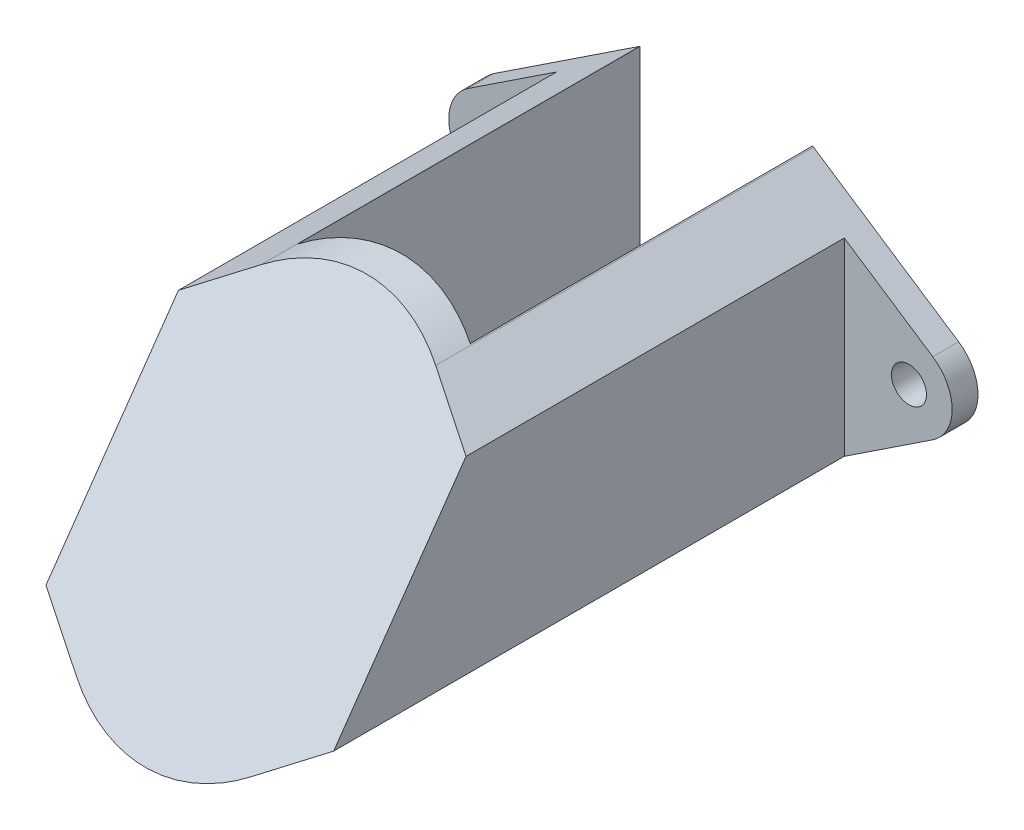
ISO-10303-21;
HEADER;
FILE_DESCRIPTION(('STEP AP214'),'2;1');
FILE_NAME('part.step','',(''),(''),'','','');
FILE_SCHEMA(('AUTOMOTIVE_DESIGN { 1 0 10303 214 1 1 1 1 }'));
ENDSEC;
DATA;
#1=APPLICATION_CONTEXT('core data for automotive mechanical design processes');
#2=APPLICATION_PROTOCOL_DEFINITION('international standard','automotive_design',2000,#1);
#3=PRODUCT_CONTEXT('',#1,'mechanical');
#4=PRODUCT('Part','Part','',(#3));
#5=PRODUCT_RELATED_PRODUCT_CATEGORY('part','',(#4));
#6=PRODUCT_DEFINITION_FORMATION('','',#4);
#7=PRODUCT_DEFINITION_CONTEXT('part definition',#1,'design');
#8=PRODUCT_DEFINITION('design','',#6,#7);
#9=PRODUCT_DEFINITION_SHAPE('','',#8);
#10=(LENGTH_UNIT() NAMED_UNIT(*) SI_UNIT(.MILLI.,.METRE.));
#11=(NAMED_UNIT(*) PLANE_ANGLE_UNIT() SI_UNIT($,.RADIAN.));
#12=(NAMED_UNIT(*) SI_UNIT($,.STERADIAN.) SOLID_ANGLE_UNIT());
#13=UNCERTAINTY_MEASURE_WITH_UNIT(LENGTH_MEASURE(1.E-05),#10,'distance_accuracy_value','');
#14=(GEOMETRIC_REPRESENTATION_CONTEXT(3) GLOBAL_UNCERTAINTY_ASSIGNED_CONTEXT((#13)) GLOBAL_UNIT_ASSIGNED_CONTEXT((#10,
#11,#12)) REPRESENTATION_CONTEXT('',''));
#15=CARTESIAN_POINT('',(0.,0.,0.));
#16=DIRECTION('',(0.,0.,1.));
#17=DIRECTION('',(1.,0.,0.));
#18=AXIS2_PLACEMENT_3D('',#15,#16,#17);
#19=CARTESIAN_POINT('',(-14.5,0.,0.));
#20=DIRECTION('',(0.,0.,1.));
#21=DIRECTION('',(1.,0.,0.));
#22=AXIS2_PLACEMENT_3D('',#19,#20,#21);
#23=PLANE('',#22);
#24=CARTESIAN_POINT('',(-14.5,0.,0.));
#25=DIRECTION('',(0.,0.,1.));
#26=DIRECTION('',(1.,0.,0.));
#27=AXIS2_PLACEMENT_3D('',#24,#25,#26);
#28=CIRCLE('',#27,1.2192);
#29=CARTESIAN_POINT('',(-13.2808,0.,0.));
#30=VERTEX_POINT('',#29);
#31=EDGE_CURVE('E184',#30,#30,#28,.T.);
#32=ORIENTED_EDGE('',*,*,#31,.T.);
#33=EDGE_LOOP('',(#32));
#34=FACE_BOUND('',#33,.T.);
#35=CARTESIAN_POINT('',(0.,0.,0.));
#36=DIRECTION('',(0.,0.,1.));
#37=DIRECTION('',(1.,0.,0.));
#38=AXIS2_PLACEMENT_3D('',#35,#36,#37);
#39=CIRCLE('',#38,11.);
#40=CARTESIAN_POINT('',(-6.00000000000001,9.21954445729288,0.));
#41=VERTEX_POINT('',#40);
#42=CARTESIAN_POINT('',(-6.06896551724138,9.174293299788,0.));
#43=VERTEX_POINT('',#42);
#44=EDGE_CURVE('E244',#41,#43,#39,.T.);
#45=ORIENTED_EDGE('',*,*,#44,.F.);
#46=DIRECTION('',(0.,-1.,0.));
#47=VECTOR('',#46,1.);
#48=CARTESIAN_POINT('',(-6.00000000000001,0.,0.));
#49=LINE('',#48,#47);
#50=CARTESIAN_POINT('',(-6.00000000000001,-9.21954445729288,0.));
#51=VERTEX_POINT('',#50);
#52=EDGE_CURVE('E45',#41,#51,#49,.T.);
#53=ORIENTED_EDGE('',*,*,#52,.T.);
#54=CARTESIAN_POINT('',(0.,0.,0.));
#55=DIRECTION('',(0.,0.,1.));
#56=DIRECTION('',(1.,0.,0.));
#57=AXIS2_PLACEMENT_3D('',#54,#55,#56);
#58=CIRCLE('',#57,11.);
#59=CARTESIAN_POINT('',(-6.06896551724137,-9.174293299788,0.));
#60=VERTEX_POINT('',#59);
#61=EDGE_CURVE('E233',#60,#51,#58,.T.);
#62=ORIENTED_EDGE('',*,*,#61,.F.);
#63=DIRECTION('',(0.834026663617092,-0.551724137931034,0.));
#64=VECTOR('',#63,1.);
#65=CARTESIAN_POINT('',(-6.06896551724137,-9.174293299788,0.));
#66=LINE('',#65,#64);
#67=CARTESIAN_POINT('',(-16.1551724137931,-2.50207999085127,0.));
#68=VERTEX_POINT('',#67);
#69=EDGE_CURVE('E229',#68,#60,#66,.T.);
#70=ORIENTED_EDGE('',*,*,#69,.F.);
#71=CARTESIAN_POINT('',(-14.5,0.,0.));
#72=DIRECTION('',(0.,0.,1.));
#73=DIRECTION('',(1.,0.,0.));
#74=AXIS2_PLACEMENT_3D('',#71,#72,#73);
#75=CIRCLE('',#74,3.);
#76=CARTESIAN_POINT('',(-16.1551724137931,2.50207999085127,0.));
#77=VERTEX_POINT('',#76);
#78=EDGE_CURVE('E226',#77,#68,#75,.T.);
#79=ORIENTED_EDGE('',*,*,#78,.F.);
#80=DIRECTION('',(-0.834026663617092,-0.551724137931034,0.));
#81=VECTOR('',#80,1.);
#82=CARTESIAN_POINT('',(-16.1551724137931,2.50207999085127,0.));
#83=LINE('',#82,#81);
#84=EDGE_CURVE('E248',#43,#77,#83,.T.);
#85=ORIENTED_EDGE('',*,*,#84,.F.);
#86=EDGE_LOOP('',(#45,#53,#62,#70,#79,#85));
#87=FACE_BOUND('',#86,.T.);
#88=ADVANCED_FACE('F37',(#34,#87),#23,.F.);
#89=CARTESIAN_POINT('',(-17.5,11.,25.));
#90=DIRECTION('',(0.,0.573576436351041,0.819152044288995));
#91=DIRECTION('',(0.,-0.819152044288995,0.573576436351041));
#92=AXIS2_PLACEMENT_3D('',#89,#90,#91);
#93=PLANE('',#92);
#94=DIRECTION('',(-0.777989561921298,-0.514654553739108,0.360364998102073));
#95=VECTOR('',#94,1.);
#96=CARTESIAN_POINT('',(-20.0941470695361,-0.10362494770183,32.7748418898341));
#97=LINE('',#96,#95);
#98=CARTESIAN_POINT('',(-6.06896551724137,9.174293299788,26.2783735940484));
#99=VERTEX_POINT('',#98);
#100=CARTESIAN_POINT('',(-10.,6.57384093322804,28.099229943869));
#101=VERTEX_POINT('',#100);
#102=EDGE_CURVE('E269',#99,#101,#97,.T.);
#103=ORIENTED_EDGE('',*,*,#102,.T.);
#104=DIRECTION('',(0.,-0.819152044288995,0.573576436351041));
#105=VECTOR('',#104,1.);
#106=CARTESIAN_POINT('',(-10.,11.,25.));
#107=LINE('',#106,#105);
#108=CARTESIAN_POINT('',(-10.,-6.57384093322804,37.3053358967445));
#109=VERTEX_POINT('',#108);
#110=EDGE_CURVE('E275',#101,#109,#107,.T.);
#111=ORIENTED_EDGE('',*,*,#110,.T.);
#112=DIRECTION('',(0.777989561921298,-0.514654553739107,0.360364998102073));
#113=VECTOR('',#112,1.);
#114=CARTESIAN_POINT('',(-4.4221835595796,-10.2636701693607,39.8889821425911));
#115=LINE('',#114,#113);
#116=CARTESIAN_POINT('',(-6.06896551724137,-9.174293299788,39.126192246565));
#117=VERTEX_POINT('',#116);
#118=EDGE_CURVE('E219',#109,#117,#115,.T.);
#119=ORIENTED_EDGE('',*,*,#118,.T.);
#120=CARTESIAN_POINT('',(0.,0.,32.7022829203067));
#121=DIRECTION('',(0.,0.573576436351041,0.819152044288995));
#122=DIRECTION('',(0.,0.819152044288995,-0.573576436351041));
#123=AXIS2_PLACEMENT_3D('',#120,#121,#122);
#124=ELLIPSE('',#123,13.428520476376,11.);
#125=CARTESIAN_POINT('',(6.06896551724138,-9.174293299788,39.126192246565));
#126=VERTEX_POINT('',#125);
#127=EDGE_CURVE('E224',#117,#126,#124,.T.);
#128=ORIENTED_EDGE('',*,*,#127,.T.);
#129=DIRECTION('',(0.777989561921297,0.514654553739108,-0.360364998102073));
#130=VECTOR('',#129,1.);
#131=CARTESIAN_POINT('',(13.1985660572277,-4.45793004269847,35.8237591410157));
#132=LINE('',#131,#130);
#133=CARTESIAN_POINT('',(9.99999999999999,-6.57384093322805,37.3053358967445));
#134=VERTEX_POINT('',#133);
#135=EDGE_CURVE('E221',#126,#134,#132,.T.);
#136=ORIENTED_EDGE('',*,*,#135,.T.);
#137=DIRECTION('',(0.,0.819152044288995,-0.573576436351041));
#138=VECTOR('',#137,1.);
#139=CARTESIAN_POINT('',(9.99999999999999,11.,25.));
#140=LINE('',#139,#138);
#141=CARTESIAN_POINT('',(9.99999999999999,6.57384093322805,28.099229943869));
#142=VERTEX_POINT('',#141);
#143=EDGE_CURVE('E272',#134,#142,#140,.T.);
#144=ORIENTED_EDGE('',*,*,#143,.T.);
#145=DIRECTION('',(-0.777989561921298,0.514654553739107,-0.360364998102073));
#146=VECTOR('',#145,1.);
#147=CARTESIAN_POINT('',(11.317764571888,5.70211517896037,28.7096188882587));
#148=LINE('',#147,#146);
#149=CARTESIAN_POINT('',(6.06896551724137,9.174293299788,26.2783735940484));
#150=VERTEX_POINT('',#149);
#151=EDGE_CURVE('E217',#142,#150,#148,.T.);
#152=ORIENTED_EDGE('',*,*,#151,.T.);
#153=CARTESIAN_POINT('',(0.,0.,32.7022829203067));
#154=DIRECTION('',(0.,0.573576436351041,0.819152044288995));
#155=DIRECTION('',(0.,0.819152044288995,-0.573576436351041));
#156=AXIS2_PLACEMENT_3D('',#153,#154,#155);
#157=ELLIPSE('',#156,13.428520476376,11.);
#158=EDGE_CURVE('E215',#150,#99,#157,.T.);
#159=ORIENTED_EDGE('',*,*,#158,.T.);
#160=EDGE_LOOP('',(#103,#111,#119,#128,#136,#144,#152,#159));
#161=FACE_BOUND('',#160,.T.);
#162=ADVANCED_FACE('F321',(#161),#93,.T.);
#163=CARTESIAN_POINT('',(-14.5,0.,45.));
#164=DIRECTION('',(0.,0.,-1.));
#165=DIRECTION('',(-1.,0.,0.));
#166=AXIS2_PLACEMENT_3D('',#163,#164,#165);
#167=CYLINDRICAL_SURFACE('',#166,3.);
#168=DIRECTION('',(0.,0.,-1.));
#169=VECTOR('',#168,1.);
#170=CARTESIAN_POINT('',(-16.1551724137931,-2.50207999085127,45.));
#171=LINE('',#170,#169);
#172=CARTESIAN_POINT('',(-16.1551724137931,-2.50207999085128,1.8));
#173=VERTEX_POINT('',#172);
#174=EDGE_CURVE('E267',#173,#68,#171,.T.);
#175=ORIENTED_EDGE('',*,*,#174,.F.);
#176=CARTESIAN_POINT('',(-14.5,0.,1.8));
#177=DIRECTION('',(0.,0.,-1.));
#178=DIRECTION('',(-1.,0.,0.));
#179=AXIS2_PLACEMENT_3D('',#176,#177,#178);
#180=CIRCLE('',#179,3.);
#181=CARTESIAN_POINT('',(-16.1551724137931,2.50207999085127,1.8));
#182=VERTEX_POINT('',#181);
#183=EDGE_CURVE('E200',#173,#182,#180,.T.);
#184=ORIENTED_EDGE('',*,*,#183,.T.);
#185=DIRECTION('',(0.,0.,-1.));
#186=VECTOR('',#185,1.);
#187=CARTESIAN_POINT('',(-16.1551724137931,2.50207999085127,45.));
#188=LINE('',#187,#186);
#189=EDGE_CURVE('E251',#182,#77,#188,.T.);
#190=ORIENTED_EDGE('',*,*,#189,.T.);
#191=ORIENTED_EDGE('',*,*,#78,.T.);
#192=EDGE_LOOP('',(#175,#184,#190,#191));
#193=FACE_BOUND('',#192,.T.);
#194=ADVANCED_FACE('F39',(#193),#167,.T.);
#195=CARTESIAN_POINT('',(-6.06896551724137,-9.174293299788,45.));
#196=DIRECTION('',(0.551724137931034,0.834026663617092,0.));
#197=DIRECTION('',(-0.834026663617092,0.551724137931034,0.));
#198=AXIS2_PLACEMENT_3D('',#195,#196,#197);
#199=PLANE('',#198);
#200=DIRECTION('',(0.,0.,1.));
#201=VECTOR('',#200,1.);
#202=CARTESIAN_POINT('',(-10.,-6.57384093322804,45.));
#203=LINE('',#202,#201);
#204=CARTESIAN_POINT('',(-10.,-6.57384093322804,1.8));
#205=VERTEX_POINT('',#204);
#206=EDGE_CURVE('E60',#205,#109,#203,.T.);
#207=ORIENTED_EDGE('',*,*,#206,.F.);
#208=DIRECTION('',(-0.834026663617092,0.551724137931034,0.));
#209=VECTOR('',#208,1.);
#210=CARTESIAN_POINT('',(-6.06896551724137,-9.174293299788,1.8));
#211=LINE('',#210,#209);
#212=EDGE_CURVE('E203',#205,#173,#211,.T.);
#213=ORIENTED_EDGE('',*,*,#212,.T.);
#214=ORIENTED_EDGE('',*,*,#174,.T.);
#215=ORIENTED_EDGE('',*,*,#69,.T.);
#216=DIRECTION('',(0.,0.,-1.));
#217=VECTOR('',#216,1.);
#218=CARTESIAN_POINT('',(-6.06896551724137,-9.174293299788,45.));
#219=LINE('',#218,#217);
#220=EDGE_CURVE('E265',#117,#60,#219,.T.);
#221=ORIENTED_EDGE('',*,*,#220,.F.);
#222=ORIENTED_EDGE('',*,*,#118,.F.);
#223=EDGE_LOOP('',(#207,#213,#214,#215,#221,#222));
#224=FACE_BOUND('',#223,.T.);
#225=ADVANCED_FACE('F293',(#224),#199,.F.);
#226=CARTESIAN_POINT('',(0.,0.,45.));
#227=DIRECTION('',(0.,0.,-1.));
#228=DIRECTION('',(-1.,0.,0.));
#229=AXIS2_PLACEMENT_3D('',#226,#227,#228);
#230=CYLINDRICAL_SURFACE('',#229,11.);
#231=ORIENTED_EDGE('',*,*,#61,.T.);
#232=DIRECTION('',(0.,0.,-1.));
#233=VECTOR('',#232,1.);
#234=CARTESIAN_POINT('',(-6.00000000000001,-9.21954445729288,45.));
#235=LINE('',#234,#233);
#236=CARTESIAN_POINT('',(-6.00000000000001,-9.21954445729285,36.7163282706398));
#237=VERTEX_POINT('',#236);
#238=EDGE_CURVE('E170',#51,#237,#235,.F.);
#239=ORIENTED_EDGE('',*,*,#238,.T.);
#240=CARTESIAN_POINT('',(0.,0.,30.2607337427839));
#241=DIRECTION('',(0.,-0.573576436351041,-0.819152044288995));
#242=DIRECTION('',(0.,0.819152044288995,-0.573576436351041));
#243=AXIS2_PLACEMENT_3D('',#240,#241,#242);
#244=ELLIPSE('',#243,13.428520476376,11.);
#245=CARTESIAN_POINT('',(6.00000000000001,-9.21954445729285,36.7163282706398));
#246=VERTEX_POINT('',#245);
#247=EDGE_CURVE('E162',#246,#237,#244,.T.);
#248=ORIENTED_EDGE('',*,*,#247,.F.);
#249=DIRECTION('',(0.,0.,-1.));
#250=VECTOR('',#249,1.);
#251=CARTESIAN_POINT('',(6.00000000000001,-9.21954445729287,45.));
#252=LINE('',#251,#250);
#253=CARTESIAN_POINT('',(6.00000000000001,-9.21954445729288,0.));
#254=VERTEX_POINT('',#253);
#255=EDGE_CURVE('E149',#246,#254,#252,.T.);
#256=ORIENTED_EDGE('',*,*,#255,.T.);
#257=CARTESIAN_POINT('',(6.06896551724138,-9.174293299788,0.));
#258=VERTEX_POINT('',#257);
#259=EDGE_CURVE('E232',#254,#258,#58,.T.);
#260=ORIENTED_EDGE('',*,*,#259,.T.);
#261=DIRECTION('',(0.,0.,-1.));
#262=VECTOR('',#261,1.);
#263=CARTESIAN_POINT('',(6.06896551724138,-9.174293299788,45.));
#264=LINE('',#263,#262);
#265=EDGE_CURVE('E262',#126,#258,#264,.T.);
#266=ORIENTED_EDGE('',*,*,#265,.F.);
#267=ORIENTED_EDGE('',*,*,#127,.F.);
#268=ORIENTED_EDGE('',*,*,#220,.T.);
#269=EDGE_LOOP('',(#231,#239,#248,#256,#260,#266,#267,#268));
#270=FACE_BOUND('',#269,.T.);
#271=ADVANCED_FACE('F169',(#270),#230,.T.);
#272=CARTESIAN_POINT('',(16.1551724137931,-2.50207999085127,45.));
#273=DIRECTION('',(-0.551724137931035,0.834026663617091,0.));
#274=DIRECTION('',(-0.834026663617091,-0.551724137931035,0.));
#275=AXIS2_PLACEMENT_3D('',#272,#273,#274);
#276=PLANE('',#275);
#277=DIRECTION('',(0.,0.,-1.));
#278=VECTOR('',#277,1.);
#279=CARTESIAN_POINT('',(16.1551724137931,-2.50207999085127,45.));
#280=LINE('',#279,#278);
#281=CARTESIAN_POINT('',(16.1551724137931,-2.50207999085127,1.8));
#282=VERTEX_POINT('',#281);
#283=CARTESIAN_POINT('',(16.1551724137931,-2.50207999085127,0.));
#284=VERTEX_POINT('',#283);
#285=EDGE_CURVE('E260',#282,#284,#280,.T.);
#286=ORIENTED_EDGE('',*,*,#285,.F.);
#287=DIRECTION('',(-0.834026663617091,-0.551724137931035,0.));
#288=VECTOR('',#287,1.);
#289=CARTESIAN_POINT('',(16.1551724137931,-2.50207999085127,1.8));
#290=LINE('',#289,#288);
#291=CARTESIAN_POINT('',(10.,-6.57384093322805,1.8));
#292=VERTEX_POINT('',#291);
#293=EDGE_CURVE('E212',#282,#292,#290,.T.);
#294=ORIENTED_EDGE('',*,*,#293,.T.);
#295=DIRECTION('',(0.,0.,-1.));
#296=VECTOR('',#295,1.);
#297=CARTESIAN_POINT('',(10.,-6.57384093322805,45.));
#298=LINE('',#297,#296);
#299=EDGE_CURVE('E195',#134,#292,#298,.T.);
#300=ORIENTED_EDGE('',*,*,#299,.F.);
#301=ORIENTED_EDGE('',*,*,#135,.F.);
#302=ORIENTED_EDGE('',*,*,#265,.T.);
#303=DIRECTION('',(0.834026663617091,0.551724137931035,0.));
#304=VECTOR('',#303,1.);
#305=CARTESIAN_POINT('',(16.1551724137931,-2.50207999085127,0.));
#306=LINE('',#305,#304);
#307=EDGE_CURVE('E235',#258,#284,#306,.T.);
#308=ORIENTED_EDGE('',*,*,#307,.T.);
#309=EDGE_LOOP('',(#286,#294,#300,#301,#302,#308));
#310=FACE_BOUND('',#309,.T.);
#311=ADVANCED_FACE('F349',(#310),#276,.F.);
#312=CARTESIAN_POINT('',(14.5,0.,45.));
#313=DIRECTION('',(0.,0.,-1.));
#314=DIRECTION('',(-1.,0.,0.));
#315=AXIS2_PLACEMENT_3D('',#312,#313,#314);
#316=CYLINDRICAL_SURFACE('',#315,3.);
#317=DIRECTION('',(0.,0.,-1.));
#318=VECTOR('',#317,1.);
#319=CARTESIAN_POINT('',(16.1551724137931,2.50207999085128,45.));
#320=LINE('',#319,#318);
#321=CARTESIAN_POINT('',(16.1551724137931,2.50207999085128,1.8));
#322=VERTEX_POINT('',#321);
#323=CARTESIAN_POINT('',(16.1551724137931,2.50207999085128,0.));
#324=VERTEX_POINT('',#323);
#325=EDGE_CURVE('E258',#322,#324,#320,.T.);
#326=ORIENTED_EDGE('',*,*,#325,.F.);
#327=CARTESIAN_POINT('',(14.5,0.,1.8));
#328=DIRECTION('',(0.,0.,-1.));
#329=DIRECTION('',(-1.,0.,0.));
#330=AXIS2_PLACEMENT_3D('',#327,#328,#329);
#331=CIRCLE('',#330,3.);
#332=EDGE_CURVE('E209',#322,#282,#331,.T.);
#333=ORIENTED_EDGE('',*,*,#332,.T.);
#334=ORIENTED_EDGE('',*,*,#285,.T.);
#335=CARTESIAN_POINT('',(14.5,0.,0.));
#336=DIRECTION('',(0.,0.,1.));
#337=DIRECTION('',(1.,0.,0.));
#338=AXIS2_PLACEMENT_3D('',#335,#336,#337);
#339=CIRCLE('',#338,3.);
#340=EDGE_CURVE('E238',#284,#324,#339,.T.);
#341=ORIENTED_EDGE('',*,*,#340,.T.);
#342=EDGE_LOOP('',(#326,#333,#334,#341));
#343=FACE_BOUND('',#342,.T.);
#344=ADVANCED_FACE('F361',(#343),#316,.T.);
#345=CARTESIAN_POINT('',(6.06896551724137,9.174293299788,45.));
#346=DIRECTION('',(-0.551724137931033,-0.834026663617092,0.));
#347=DIRECTION('',(0.834026663617092,-0.551724137931034,0.));
#348=AXIS2_PLACEMENT_3D('',#345,#346,#347);
#349=PLANE('',#348);
#350=DIRECTION('',(0.,0.,1.));
#351=VECTOR('',#350,1.);
#352=CARTESIAN_POINT('',(10.,6.57384093322805,45.));
#353=LINE('',#352,#351);
#354=CARTESIAN_POINT('',(10.,6.57384093322805,1.8));
#355=VERTEX_POINT('',#354);
#356=EDGE_CURVE('E193',#355,#142,#353,.T.);
#357=ORIENTED_EDGE('',*,*,#356,.F.);
#358=DIRECTION('',(0.834026663617092,-0.551724137931034,0.));
#359=VECTOR('',#358,1.);
#360=CARTESIAN_POINT('',(6.06896551724137,9.174293299788,1.8));
#361=LINE('',#360,#359);
#362=EDGE_CURVE('E206',#355,#322,#361,.T.);
#363=ORIENTED_EDGE('',*,*,#362,.T.);
#364=ORIENTED_EDGE('',*,*,#325,.T.);
#365=DIRECTION('',(-0.834026663617092,0.551724137931034,0.));
#366=VECTOR('',#365,1.);
#367=CARTESIAN_POINT('',(6.06896551724137,9.174293299788,0.));
#368=LINE('',#367,#366);
#369=CARTESIAN_POINT('',(6.06896551724137,9.174293299788,0.));
#370=VERTEX_POINT('',#369);
#371=EDGE_CURVE('E241',#324,#370,#368,.T.);
#372=ORIENTED_EDGE('',*,*,#371,.T.);
#373=DIRECTION('',(0.,0.,-1.));
#374=VECTOR('',#373,1.);
#375=CARTESIAN_POINT('',(6.06896551724137,9.174293299788,45.));
#376=LINE('',#375,#374);
#377=EDGE_CURVE('E256',#150,#370,#376,.T.);
#378=ORIENTED_EDGE('',*,*,#377,.F.);
#379=ORIENTED_EDGE('',*,*,#151,.F.);
#380=EDGE_LOOP('',(#357,#363,#364,#372,#378,#379));
#381=FACE_BOUND('',#380,.T.);
#382=ADVANCED_FACE('F357',(#381),#349,.F.);
#383=CARTESIAN_POINT('',(0.,0.,45.));
#384=DIRECTION('',(0.,0.,-1.));
#385=DIRECTION('',(-1.,0.,0.));
#386=AXIS2_PLACEMENT_3D('',#383,#384,#385);
#387=CYLINDRICAL_SURFACE('',#386,11.);
#388=CARTESIAN_POINT('',(0.,0.,30.2607337427839));
#389=DIRECTION('',(0.,-0.573576436351041,-0.819152044288995));
#390=DIRECTION('',(0.,0.819152044288995,-0.573576436351041));
#391=AXIS2_PLACEMENT_3D('',#388,#389,#390);
#392=ELLIPSE('',#391,13.428520476376,11.);
#393=CARTESIAN_POINT('',(-6.00000000000001,9.2195444572929,23.8051392149279));
#394=VERTEX_POINT('',#393);
#395=CARTESIAN_POINT('',(6.00000000000001,9.2195444572929,23.8051392149279));
#396=VERTEX_POINT('',#395);
#397=EDGE_CURVE('E12',#394,#396,#392,.T.);
#398=ORIENTED_EDGE('',*,*,#397,.F.);
#399=DIRECTION('',(0.,0.,-1.));
#400=VECTOR('',#399,1.);
#401=CARTESIAN_POINT('',(-6.00000000000001,9.21954445729287,45.));
#402=LINE('',#401,#400);
#403=EDGE_CURVE('E157',#394,#41,#402,.T.);
#404=ORIENTED_EDGE('',*,*,#403,.T.);
#405=ORIENTED_EDGE('',*,*,#44,.T.);
#406=DIRECTION('',(0.,0.,-1.));
#407=VECTOR('',#406,1.);
#408=CARTESIAN_POINT('',(-6.06896551724138,9.174293299788,45.));
#409=LINE('',#408,#407);
#410=EDGE_CURVE('E253',#99,#43,#409,.T.);
#411=ORIENTED_EDGE('',*,*,#410,.F.);
#412=ORIENTED_EDGE('',*,*,#158,.F.);
#413=ORIENTED_EDGE('',*,*,#377,.T.);
#414=CARTESIAN_POINT('',(6.00000000000001,9.21954445729287,0.));
#415=VERTEX_POINT('',#414);
#416=EDGE_CURVE('E245',#370,#415,#39,.T.);
#417=ORIENTED_EDGE('',*,*,#416,.T.);
#418=DIRECTION('',(0.,0.,-1.));
#419=VECTOR('',#418,1.);
#420=CARTESIAN_POINT('',(6.00000000000001,9.21954445729287,45.));
#421=LINE('',#420,#419);
#422=EDGE_CURVE('E52',#415,#396,#421,.F.);
#423=ORIENTED_EDGE('',*,*,#422,.T.);
#424=EDGE_LOOP('',(#398,#404,#405,#411,#412,#413,#417,#423));
#425=FACE_BOUND('',#424,.T.);
#426=ADVANCED_FACE('F305',(#425),#387,.T.);
#427=CARTESIAN_POINT('',(-16.1551724137931,2.50207999085127,45.));
#428=DIRECTION('',(0.551724137931034,-0.834026663617091,0.));
#429=DIRECTION('',(0.834026663617092,0.551724137931034,0.));
#430=AXIS2_PLACEMENT_3D('',#427,#428,#429);
#431=PLANE('',#430);
#432=ORIENTED_EDGE('',*,*,#189,.F.);
#433=DIRECTION('',(0.834026663617092,0.551724137931034,0.));
#434=VECTOR('',#433,1.);
#435=CARTESIAN_POINT('',(-16.1551724137931,2.50207999085127,1.8));
#436=LINE('',#435,#434);
#437=CARTESIAN_POINT('',(-10.,6.57384093322804,1.8));
#438=VERTEX_POINT('',#437);
#439=EDGE_CURVE('E277',#182,#438,#436,.T.);
#440=ORIENTED_EDGE('',*,*,#439,.T.);
#441=DIRECTION('',(0.,0.,-1.));
#442=VECTOR('',#441,1.);
#443=CARTESIAN_POINT('',(-10.,6.57384093322804,45.));
#444=LINE('',#443,#442);
#445=EDGE_CURVE('E197',#101,#438,#444,.T.);
#446=ORIENTED_EDGE('',*,*,#445,.F.);
#447=ORIENTED_EDGE('',*,*,#102,.F.);
#448=ORIENTED_EDGE('',*,*,#410,.T.);
#449=ORIENTED_EDGE('',*,*,#84,.T.);
#450=EDGE_LOOP('',(#432,#440,#446,#447,#448,#449));
#451=FACE_BOUND('',#450,.T.);
#452=ADVANCED_FACE('F299',(#451),#431,.F.);
#453=CARTESIAN_POINT('',(14.5,0.,0.));
#454=DIRECTION('',(0.,0.,1.));
#455=DIRECTION('',(1.,0.,0.));
#456=AXIS2_PLACEMENT_3D('',#453,#454,#455);
#457=CIRCLE('',#456,1.2192);
#458=CARTESIAN_POINT('',(15.7192,0.,0.));
#459=VERTEX_POINT('',#458);
#460=EDGE_CURVE('E174',#459,#459,#457,.T.);
#461=ORIENTED_EDGE('',*,*,#460,.T.);
#462=EDGE_LOOP('',(#461));
#463=FACE_BOUND('',#462,.T.);
#464=ORIENTED_EDGE('',*,*,#259,.F.);
#465=DIRECTION('',(0.,1.,0.));
#466=VECTOR('',#465,1.);
#467=CARTESIAN_POINT('',(6.00000000000001,0.,0.));
#468=LINE('',#467,#466);
#469=EDGE_CURVE('E153',#254,#415,#468,.T.);
#470=ORIENTED_EDGE('',*,*,#469,.T.);
#471=ORIENTED_EDGE('',*,*,#416,.F.);
#472=ORIENTED_EDGE('',*,*,#371,.F.);
#473=ORIENTED_EDGE('',*,*,#340,.F.);
#474=ORIENTED_EDGE('',*,*,#307,.F.);
#475=EDGE_LOOP('',(#464,#470,#471,#472,#473,#474));
#476=FACE_BOUND('',#475,.T.);
#477=ADVANCED_FACE('F324',(#463,#476),#23,.F.);
#478=CARTESIAN_POINT('',(10.,-12.2070171111801,40.4045658406135));
#479=DIRECTION('',(1.,0.,0.));
#480=DIRECTION('',(0.,0.,-1.));
#481=AXIS2_PLACEMENT_3D('',#478,#479,#480);
#482=PLANE('',#481);
#483=ORIENTED_EDGE('',*,*,#299,.T.);
#484=DIRECTION('',(0.,-1.,0.));
#485=VECTOR('',#484,1.);
#486=CARTESIAN_POINT('',(10.,-12.2070171111801,1.8));
#487=LINE('',#486,#485);
#488=EDGE_CURVE('E190',#355,#292,#487,.T.);
#489=ORIENTED_EDGE('',*,*,#488,.F.);
#490=ORIENTED_EDGE('',*,*,#356,.T.);
#491=ORIENTED_EDGE('',*,*,#143,.F.);
#492=EDGE_LOOP('',(#483,#489,#490,#491));
#493=FACE_BOUND('',#492,.T.);
#494=ADVANCED_FACE('F332',(#493),#482,.T.);
#495=CARTESIAN_POINT('',(0.,0.,1.8));
#496=DIRECTION('',(0.,0.,-1.));
#497=DIRECTION('',(-1.,0.,0.));
#498=AXIS2_PLACEMENT_3D('',#495,#496,#497);
#499=PLANE('',#498);
#500=CARTESIAN_POINT('',(14.5,0.,1.8));
#501=DIRECTION('',(0.,0.,1.));
#502=DIRECTION('',(1.,0.,0.));
#503=AXIS2_PLACEMENT_3D('',#500,#501,#502);
#504=CIRCLE('',#503,1.2192);
#505=CARTESIAN_POINT('',(15.7192,0.,1.8));
#506=VERTEX_POINT('',#505);
#507=EDGE_CURVE('E171',#506,#506,#504,.T.);
#508=ORIENTED_EDGE('',*,*,#507,.F.);
#509=EDGE_LOOP('',(#508));
#510=FACE_BOUND('',#509,.T.);
#511=ORIENTED_EDGE('',*,*,#332,.F.);
#512=ORIENTED_EDGE('',*,*,#362,.F.);
#513=ORIENTED_EDGE('',*,*,#488,.T.);
#514=ORIENTED_EDGE('',*,*,#293,.F.);
#515=EDGE_LOOP('',(#511,#512,#513,#514));
#516=FACE_BOUND('',#515,.T.);
#517=ADVANCED_FACE('F338',(#510,#516),#499,.F.);
#518=CARTESIAN_POINT('',(-14.5,0.,1.8));
#519=DIRECTION('',(0.,0.,1.));
#520=DIRECTION('',(1.,0.,0.));
#521=AXIS2_PLACEMENT_3D('',#518,#519,#520);
#522=CIRCLE('',#521,1.2192);
#523=CARTESIAN_POINT('',(-13.2808,0.,1.8));
#524=VERTEX_POINT('',#523);
#525=EDGE_CURVE('E181',#524,#524,#522,.T.);
#526=ORIENTED_EDGE('',*,*,#525,.F.);
#527=EDGE_LOOP('',(#526));
#528=FACE_BOUND('',#527,.T.);
#529=DIRECTION('',(0.,1.,0.));
#530=VECTOR('',#529,1.);
#531=CARTESIAN_POINT('',(-10.,-12.2070171111801,1.8));
#532=LINE('',#531,#530);
#533=EDGE_CURVE('E187',#205,#438,#532,.T.);
#534=ORIENTED_EDGE('',*,*,#533,.T.);
#535=ORIENTED_EDGE('',*,*,#439,.F.);
#536=ORIENTED_EDGE('',*,*,#183,.F.);
#537=ORIENTED_EDGE('',*,*,#212,.F.);
#538=EDGE_LOOP('',(#534,#535,#536,#537));
#539=FACE_BOUND('',#538,.T.);
#540=ADVANCED_FACE('F353',(#528,#539),#499,.F.);
#541=CARTESIAN_POINT('',(-10.,-12.2070171111801,40.4045658406135));
#542=DIRECTION('',(-1.,0.,0.));
#543=DIRECTION('',(0.,0.,1.));
#544=AXIS2_PLACEMENT_3D('',#541,#542,#543);
#545=PLANE('',#544);
#546=ORIENTED_EDGE('',*,*,#206,.T.);
#547=ORIENTED_EDGE('',*,*,#110,.F.);
#548=ORIENTED_EDGE('',*,*,#445,.T.);
#549=ORIENTED_EDGE('',*,*,#533,.F.);
#550=EDGE_LOOP('',(#546,#547,#548,#549));
#551=FACE_BOUND('',#550,.T.);
#552=ADVANCED_FACE('F354',(#551),#545,.T.);
#553=CARTESIAN_POINT('',(-14.5,0.,1.8));
#554=DIRECTION('',(0.,0.,1.));
#555=DIRECTION('',(1.,0.,0.));
#556=AXIS2_PLACEMENT_3D('',#553,#554,#555);
#557=CYLINDRICAL_SURFACE('',#556,1.2192);
#558=ORIENTED_EDGE('',*,*,#31,.F.);
#559=EDGE_LOOP('',(#558));
#560=FACE_BOUND('',#559,.T.);
#561=ORIENTED_EDGE('',*,*,#525,.T.);
#562=EDGE_LOOP('',(#561));
#563=FACE_BOUND('',#562,.T.);
#564=ADVANCED_FACE('F374',(#560,#563),#557,.F.);
#565=CARTESIAN_POINT('',(14.5,0.,1.8));
#566=DIRECTION('',(0.,0.,1.));
#567=DIRECTION('',(1.,0.,0.));
#568=AXIS2_PLACEMENT_3D('',#565,#566,#567);
#569=CYLINDRICAL_SURFACE('',#568,1.2192);
#570=ORIENTED_EDGE('',*,*,#460,.F.);
#571=EDGE_LOOP('',(#570));
#572=FACE_BOUND('',#571,.T.);
#573=ORIENTED_EDGE('',*,*,#507,.T.);
#574=EDGE_LOOP('',(#573));
#575=FACE_BOUND('',#574,.T.);
#576=ADVANCED_FACE('F317',(#572,#575),#569,.F.);
#577=CARTESIAN_POINT('',(0.,14.2178940988305,20.3052571173155));
#578=DIRECTION('',(0.,-0.573576436351041,-0.819152044288995));
#579=DIRECTION('',(0.,0.819152044288995,-0.573576436351041));
#580=AXIS2_PLACEMENT_3D('',#577,#578,#579);
#581=PLANE('',#580);
#582=ORIENTED_EDGE('',*,*,#247,.T.);
#583=DIRECTION('',(0.,-0.819152044288995,0.573576436351041));
#584=VECTOR('',#583,1.);
#585=CARTESIAN_POINT('',(-6.00000000000001,40.5829410703631,1.84425248259553));
#586=LINE('',#585,#584);
#587=EDGE_CURVE('E165',#394,#237,#586,.T.);
#588=ORIENTED_EDGE('',*,*,#587,.F.);
#589=ORIENTED_EDGE('',*,*,#397,.T.);
#590=DIRECTION('',(0.,0.819152044288995,-0.573576436351041));
#591=VECTOR('',#590,1.);
#592=CARTESIAN_POINT('',(6.00000000000001,40.5829410703631,1.84425248259553));
#593=LINE('',#592,#591);
#594=EDGE_CURVE('E152',#246,#396,#593,.T.);
#595=ORIENTED_EDGE('',*,*,#594,.F.);
#596=EDGE_LOOP('',(#582,#588,#589,#595));
#597=FACE_BOUND('',#596,.T.);
#598=ADVANCED_FACE('F160',(#597),#581,.T.);
#599=CARTESIAN_POINT('',(-6.00000000000001,22.7461577598238,-23.6293140490424));
#600=DIRECTION('',(-1.,0.,0.));
#601=DIRECTION('',(0.,0.,1.));
#602=AXIS2_PLACEMENT_3D('',#599,#600,#601);
#603=PLANE('',#602);
#604=ORIENTED_EDGE('',*,*,#52,.F.);
#605=ORIENTED_EDGE('',*,*,#403,.F.);
#606=ORIENTED_EDGE('',*,*,#587,.T.);
#607=ORIENTED_EDGE('',*,*,#238,.F.);
#608=EDGE_LOOP('',(#604,#605,#606,#607));
#609=FACE_BOUND('',#608,.T.);
#610=ADVANCED_FACE('F309',(#609),#603,.F.);
#611=CARTESIAN_POINT('',(6.00000000000001,22.7461577598238,-23.6293140490424));
#612=DIRECTION('',(1.,0.,0.));
#613=DIRECTION('',(0.,0.,-1.));
#614=AXIS2_PLACEMENT_3D('',#611,#612,#613);
#615=PLANE('',#614);
#616=ORIENTED_EDGE('',*,*,#594,.T.);
#617=ORIENTED_EDGE('',*,*,#422,.F.);
#618=ORIENTED_EDGE('',*,*,#469,.F.);
#619=ORIENTED_EDGE('',*,*,#255,.F.);
#620=EDGE_LOOP('',(#616,#617,#618,#619));
#621=FACE_BOUND('',#620,.T.);
#622=ADVANCED_FACE('F151',(#621),#615,.F.);
#623=CLOSED_SHELL('',(#88,#162,#194,#225,#271,#311,#344,#382,#426,#452,#477,#494,#517,#540,#552,
#564,#576,#598,#610,#622));
#624=MANIFOLD_SOLID_BREP('B2',#623);
#625=ADVANCED_BREP_SHAPE_REPRESENTATION('',(#18,#624),#14);
#626=SHAPE_DEFINITION_REPRESENTATION(#9,#625);
ENDSEC;
END-ISO-10303-21;
